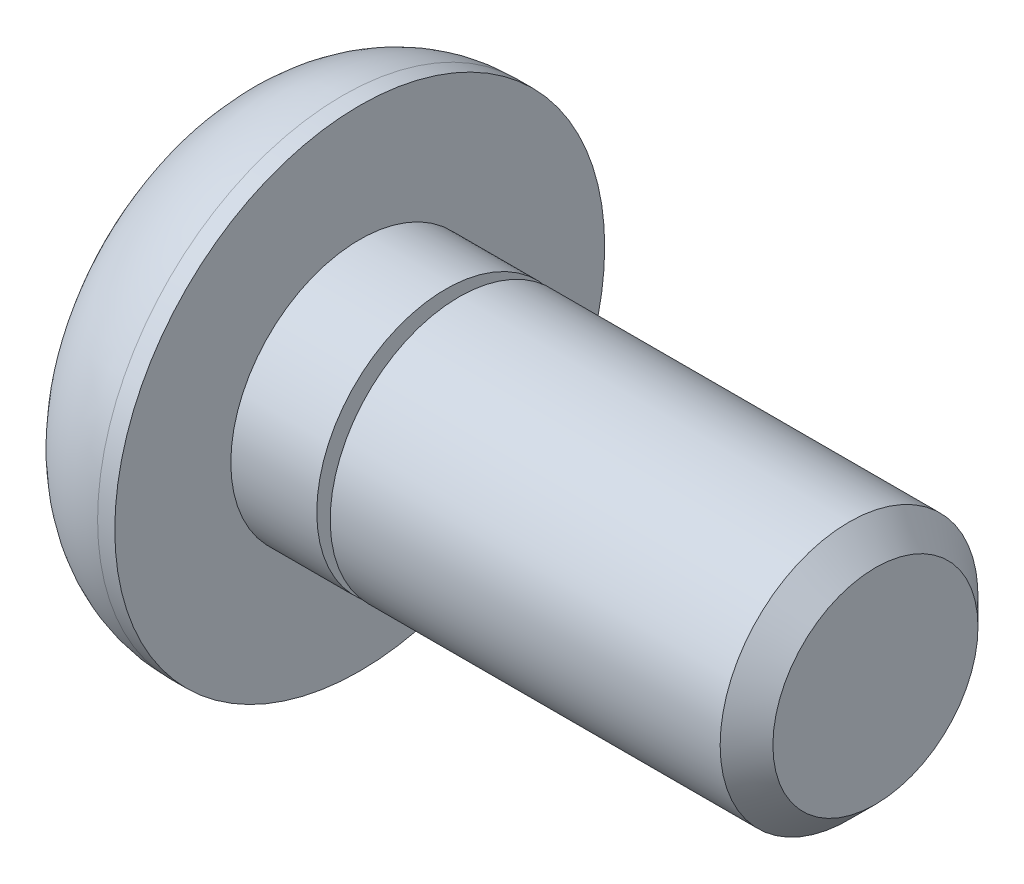
ISO-10303-21;
HEADER;
FILE_DESCRIPTION(('STEP AP214'),'2;1');
FILE_NAME('part.step','',(''),(''),'','','');
FILE_SCHEMA(('AUTOMOTIVE_DESIGN { 1 0 10303 214 1 1 1 1 }'));
ENDSEC;
DATA;
#1=APPLICATION_CONTEXT('core data for automotive mechanical design processes');
#2=APPLICATION_PROTOCOL_DEFINITION('international standard','automotive_design',2000,#1);
#3=PRODUCT_CONTEXT('',#1,'mechanical');
#4=PRODUCT('Part','Part','',(#3));
#5=PRODUCT_RELATED_PRODUCT_CATEGORY('part','',(#4));
#6=PRODUCT_DEFINITION_FORMATION('','',#4);
#7=PRODUCT_DEFINITION_CONTEXT('part definition',#1,'design');
#8=PRODUCT_DEFINITION('design','',#6,#7);
#9=PRODUCT_DEFINITION_SHAPE('','',#8);
#10=(LENGTH_UNIT() NAMED_UNIT(*) SI_UNIT(.MILLI.,.METRE.));
#11=(NAMED_UNIT(*) PLANE_ANGLE_UNIT() SI_UNIT($,.RADIAN.));
#12=(NAMED_UNIT(*) SI_UNIT($,.STERADIAN.) SOLID_ANGLE_UNIT());
#13=UNCERTAINTY_MEASURE_WITH_UNIT(LENGTH_MEASURE(1.E-05),#10,'distance_accuracy_value','');
#14=(GEOMETRIC_REPRESENTATION_CONTEXT(3) GLOBAL_UNCERTAINTY_ASSIGNED_CONTEXT((#13)) GLOBAL_UNIT_ASSIGNED_CONTEXT((#10,
#11,#12)) REPRESENTATION_CONTEXT('',''));
#15=CARTESIAN_POINT('',(0.,0.,0.));
#16=DIRECTION('',(0.,0.,1.));
#17=DIRECTION('',(1.,0.,0.));
#18=AXIS2_PLACEMENT_3D('',#15,#16,#17);
#19=CARTESIAN_POINT('',(6.,0.596637499999982,0.));
#20=DIRECTION('',(1.,0.,0.));
#21=DIRECTION('',(0.,0.,-1.));
#22=AXIS2_PLACEMENT_3D('',#19,#20,#21);
#23=PLANE('',#22);
#24=CARTESIAN_POINT('',(6.00000000014234,0.,0.));
#25=DIRECTION('',(-1.,0.,0.));
#26=DIRECTION('',(0.,0.,1.));
#27=AXIS2_PLACEMENT_3D('',#24,#25,#26);
#28=CIRCLE('',#27,1.19327500010516);
#29=CARTESIAN_POINT('',(6.00000000014234,0.,1.19327500010516));
#30=VERTEX_POINT('',#29);
#31=EDGE_CURVE('E21',#30,#30,#28,.T.);
#32=ORIENTED_EDGE('',*,*,#31,.F.);
#33=EDGE_LOOP('',(#32));
#34=FACE_BOUND('',#33,.T.);
#35=ADVANCED_FACE('F17',(#34),#23,.T.);
#36=CARTESIAN_POINT('',(-0.614001038059087,0.,0.));
#37=DIRECTION('',(-1.,0.,0.));
#38=DIRECTION('',(0.,0.,1.));
#39=AXIS2_PLACEMENT_3D('',#36,#37,#38);
#40=CONICAL_SURFACE('',#39,1.16192999968237,1.04719754998043);
#41=CARTESIAN_POINT('',(-0.610000000702341,1.00000000016001,0.577948959481232));
#42=CARTESIAN_POINT('',(-0.596292373771173,1.00000000005746,0.530505986152384));
#43=CARTESIAN_POINT('',(-0.583741747935691,1.00000000001539,0.482687327252592));
#44=CARTESIAN_POINT('',(-0.561558908292835,0.99999999998455,0.386271956564463));
#45=CARTESIAN_POINT('',(-0.551933247538482,0.999999999995897,0.337673750824826));
#46=CARTESIAN_POINT('',(-0.536453805257682,1.00000000000398,0.241023607057818));
#47=CARTESIAN_POINT('',(-0.530517364442524,1.00000000000106,0.192985324564532));
#48=CARTESIAN_POINT('',(-0.522547942344062,0.999999999998919,0.0966311212873839));
#49=CARTESIAN_POINT('',(-0.52051070889006,0.999999999999701,0.0483155606412382));
#50=CARTESIAN_POINT('',(-0.520510708889989,1.00000000000027,-0.0483155606524448));
#51=CARTESIAN_POINT('',(-0.522547942344025,1.00000000000007,-0.096631121299982));
#52=CARTESIAN_POINT('',(-0.530517364444811,0.999999999999911,-0.192985324579123));
#53=CARTESIAN_POINT('',(-0.536453805262252,0.999999999999966,-0.241023607073011));
#54=CARTESIAN_POINT('',(-0.551933247539297,1.00000000000001,-0.337673750843559));
#55=CARTESIAN_POINT('',(-0.561558908287421,0.999999999999999,-0.386271956586184));
#56=CARTESIAN_POINT('',(-0.583741747950606,0.999999999999976,-0.482687327272268));
#57=CARTESIAN_POINT('',(-0.596292373812606,0.999999999999965,-0.530505986167036));
#58=CARTESIAN_POINT('',(-0.610000000807134,0.999999999999988,-0.577948959481243));
#59=B_SPLINE_CURVE_WITH_KNOTS('',3,(#41,#42,#43,#44,#45,#46,#47,#48,#49,#50,#51,#52,#53,#54,#55,
#56,#57,#58),.UNSPECIFIED.,.F.,.F.,(4,2,2,2,2,2,2,2,4),(0.,0.148196356180967,0.296722322337336,
0.44178762554198,0.5866946415313,0.731601657524353,0.876666960732386,1.02519292689264,
1.17338928307905),.UNSPECIFIED.);
#60=CARTESIAN_POINT('',(-0.610000000832481,0.99999999990011,0.577948959741792));
#61=VERTEX_POINT('',#60);
#62=CARTESIAN_POINT('',(-0.61000000079913,0.999999999900102,-0.577948959626364));
#63=VERTEX_POINT('',#62);
#64=EDGE_CURVE('E89',#61,#63,#59,.T.);
#65=ORIENTED_EDGE('',*,*,#64,.T.);
#66=CARTESIAN_POINT('',(-0.610000000702503,0.999999999904356,-0.577948959924068));
#67=CARTESIAN_POINT('',(-0.59534917236543,0.956037643383835,-0.603317483370583));
#68=CARTESIAN_POINT('',(-0.582026094801958,0.911695794913255,-0.628904993111493));
#69=CARTESIAN_POINT('',(-0.558773550909938,0.8222447053849,-0.680522837345608));
#70=CARTESIAN_POINT('',(-0.548852305246655,0.777133878113073,-0.70655408716543));
#71=CARTESIAN_POINT('',(-0.533412574891243,0.687471128215697,-0.758294070280611));
#72=CARTESIAN_POINT('',(-0.527791260557001,0.642932979674916,-0.783994855226436));
#73=CARTESIAN_POINT('',(-0.521087723057258,0.553647739545833,-0.835516995925321));
#74=CARTESIAN_POINT('',(-0.519999941217122,0.508900971220479,-0.861338165139156));
#75=CARTESIAN_POINT('',(-0.522295914447888,0.425330610921353,-0.909562528489911));
#76=CARTESIAN_POINT('',(-0.525115940353142,0.386494336446535,-0.931973041077401));
#77=CARTESIAN_POINT('',(-0.534043518535486,0.309074734851091,-0.976648102718746));
#78=CARTESIAN_POINT('',(-0.54015410337029,0.270491674343329,-0.99891249792337));
#79=CARTESIAN_POINT('',(-0.555426060565283,0.192913202624641,-1.04367923573479));
#80=CARTESIAN_POINT('',(-0.564651995774482,0.153927580984834,-1.06617592925939));
#81=CARTESIAN_POINT('',(-0.585589692570095,0.0765368941804281,-1.11083430559061));
#82=CARTESIAN_POINT('',(-0.597296553112533,0.0381308420150152,-1.13299655794708));
#83=CARTESIAN_POINT('',(-0.610000000806537,1.77696117710666E-10,-1.15499999989744));
#84=B_SPLINE_CURVE_WITH_KNOTS('',3,(#66,#67,#68,#69,#70,#71,#72,#73,#74,#75,#76,#77,#78,#79,#80,
#81,#82,#83),.UNSPECIFIED.,.F.,.F.,(4,2,2,2,2,2,2,2,4),(0.,0.158549163497736,0.317478810934161,
0.472477440460331,0.627285966377526,0.761939339583402,0.896717021373196,1.03447934505249,
1.17197201608933),.UNSPECIFIED.);
#85=CARTESIAN_POINT('',(-0.610000000799194,0.,-1.15499999988472));
#86=VERTEX_POINT('',#85);
#87=EDGE_CURVE('E117',#63,#86,#84,.T.);
#88=ORIENTED_EDGE('',*,*,#87,.T.);
#89=CARTESIAN_POINT('',(-0.610000000702488,-2.55601366903664E-10,-1.15500000003725));
#90=CARTESIAN_POINT('',(-0.595349172365418,-0.0439623566736196,-1.12963147641311));
#91=CARTESIAN_POINT('',(-0.582026094801948,-0.0883042051021496,-1.10404396659933));
#92=CARTESIAN_POINT('',(-0.55877355090993,-0.177755294599673,-1.05242612231179));
#93=CARTESIAN_POINT('',(-0.548852305246647,-0.222866121882847,-1.02639487251163));
#94=CARTESIAN_POINT('',(-0.533412574891236,-0.312528871788291,-0.974654889410436));
#95=CARTESIAN_POINT('',(-0.527791260556993,-0.357067020326149,-0.948954104459547));
#96=CARTESIAN_POINT('',(-0.521087723057251,-0.446352260453107,-0.897431963756984));
#97=CARTESIAN_POINT('',(-0.519999941217116,-0.491099028779255,-0.871610794544527));
#98=CARTESIAN_POINT('',(-0.522295914447882,-0.574669389078878,-0.823386431194634));
#99=CARTESIAN_POINT('',(-0.525115940353136,-0.613505663553528,-0.80097591860685));
#100=CARTESIAN_POINT('',(-0.53404351853548,-0.690925265148848,-0.756300856965289));
#101=CARTESIAN_POINT('',(-0.540154103370285,-0.729508325656655,-0.734036461760741));
#102=CARTESIAN_POINT('',(-0.555426060565279,-0.80708679737538,-0.689269723949379));
#103=CARTESIAN_POINT('',(-0.564651995774478,-0.846072419015179,-0.666773030424763));
#104=CARTESIAN_POINT('',(-0.585589692570092,-0.923463105819568,-0.622114654093512));
#105=CARTESIAN_POINT('',(-0.597296553112531,-0.961869157984972,-0.59995240173703));
#106=CARTESIAN_POINT('',(-0.610000000806535,-0.99999999982231,-0.577948959786697));
#107=B_SPLINE_CURVE_WITH_KNOTS('',3,(#89,#90,#91,#92,#93,#94,#95,#96,#97,#98,#99,#100,#101,#102,
#103,#104,#105,#106),.UNSPECIFIED.,.F.,.F.,(4,2,2,2,2,2,2,2,4),(0.,0.158549163497733,
0.317478810934154,0.47247744046032,0.627285966377512,0.76193933958339,0.896717021373186,
1.03447934505248,1.17197201608933),.UNSPECIFIED.);
#108=CARTESIAN_POINT('',(-0.610000000799111,-0.99999999990014,-0.577948959626333));
#109=VERTEX_POINT('',#108);
#110=EDGE_CURVE('E147',#86,#109,#107,.T.);
#111=ORIENTED_EDGE('',*,*,#110,.T.);
#112=CARTESIAN_POINT('',(-0.610000000702289,-1.00000000016004,-0.57794895948121));
#113=CARTESIAN_POINT('',(-0.596292373771131,-1.00000000005747,-0.530505986152361));
#114=CARTESIAN_POINT('',(-0.583741747935654,-1.00000000001539,-0.482687327252571));
#115=CARTESIAN_POINT('',(-0.561558908292803,-0.999999999984547,-0.386271956564446));
#116=CARTESIAN_POINT('',(-0.551933247538449,-0.999999999995896,-0.337673750824812));
#117=CARTESIAN_POINT('',(-0.536453805257649,-1.00000000000398,-0.241023607057808));
#118=CARTESIAN_POINT('',(-0.530517364442491,-1.00000000000106,-0.192985324564524));
#119=CARTESIAN_POINT('',(-0.522547942344029,-0.999999999998919,-0.0966311212873802));
#120=CARTESIAN_POINT('',(-0.520510708890027,-0.999999999999701,-0.0483155606412368));
#121=CARTESIAN_POINT('',(-0.520510708889956,-1.00000000000027,0.0483155606524395));
#122=CARTESIAN_POINT('',(-0.522547942343992,-1.00000000000007,0.0966311212999723));
#123=CARTESIAN_POINT('',(-0.530517364444777,-0.999999999999911,0.192985324579104));
#124=CARTESIAN_POINT('',(-0.536453805262217,-0.999999999999966,0.241023607072988));
#125=CARTESIAN_POINT('',(-0.551933247539259,-1.00000000000001,0.337673750843527));
#126=CARTESIAN_POINT('',(-0.561558908287382,-0.999999999999999,0.386271956586148));
#127=CARTESIAN_POINT('',(-0.583741747950565,-0.999999999999976,0.482687327272221));
#128=CARTESIAN_POINT('',(-0.596292373812563,-0.999999999999965,0.530505986166985));
#129=CARTESIAN_POINT('',(-0.61000000080709,-0.999999999999988,0.577948959481188));
#130=B_SPLINE_CURVE_WITH_KNOTS('',3,(#112,#113,#114,#115,#116,#117,#118,#119,#120,#121,#122,
#123,#124,#125,#126,#127,#128,#129),.UNSPECIFIED.,.F.,.F.,(4,2,2,2,2,2,2,2,4),(0.,
0.14819635618096,0.296722322337322,0.441787625541959,0.586694641531272,0.731601657524312,
0.876666960732332,1.02519292689257,1.17338928307897),.UNSPECIFIED.);
#131=CARTESIAN_POINT('',(-0.610000000799104,-0.999999999900135,0.577948959626316));
#132=VERTEX_POINT('',#131);
#133=EDGE_CURVE('E142',#109,#132,#130,.T.);
#134=ORIENTED_EDGE('',*,*,#133,.T.);
#135=CARTESIAN_POINT('',(-0.610000000702512,-0.999999999904404,0.57794895992401));
#136=CARTESIAN_POINT('',(-0.595349172365428,-0.956037643383894,0.603317483370539));
#137=CARTESIAN_POINT('',(-0.582026094801951,-0.911695794913317,0.628904993111454));
#138=CARTESIAN_POINT('',(-0.558773550909926,-0.822244705384964,0.680522837345574));
#139=CARTESIAN_POINT('',(-0.548852305246643,-0.777133878113135,0.706554087165395));
#140=CARTESIAN_POINT('',(-0.53341257489123,-0.687471128215758,0.758294070280576));
#141=CARTESIAN_POINT('',(-0.527791260556986,-0.642932979674976,0.783994855226401));
#142=CARTESIAN_POINT('',(-0.521087723057242,-0.553647739545893,0.835516995925286));
#143=CARTESIAN_POINT('',(-0.519999941217106,-0.508900971220539,0.861338165139122));
#144=CARTESIAN_POINT('',(-0.522295914447871,-0.425330610921409,0.909562528489878));
#145=CARTESIAN_POINT('',(-0.525115940353125,-0.386494336446589,0.93197304107737));
#146=CARTESIAN_POINT('',(-0.534043518535469,-0.309074734851141,0.976648102718717));
#147=CARTESIAN_POINT('',(-0.540154103370274,-0.270491674343376,0.998912497923343));
#148=CARTESIAN_POINT('',(-0.555426060565268,-0.192913202624683,1.04367923573477));
#149=CARTESIAN_POINT('',(-0.564651995774468,-0.153927580984873,1.06617592925937));
#150=CARTESIAN_POINT('',(-0.585589692570083,-0.0765368941804624,1.11083430559059));
#151=CARTESIAN_POINT('',(-0.597296553112522,-0.0381308420150469,1.13299655794706));
#152=CARTESIAN_POINT('',(-0.610000000806527,-1.77725566887248E-10,1.15499999989743));
#153=B_SPLINE_CURVE_WITH_KNOTS('',3,(#135,#136,#137,#138,#139,#140,#141,#142,#143,#144,#145,
#146,#147,#148,#149,#150,#151,#152),.UNSPECIFIED.,.F.,.F.,(4,2,2,2,2,2,2,2,4),(0.,
0.158549163497739,0.317478810934166,0.472477440460337,0.627285966377535,0.761939339583419,
0.896717021373221,1.03447934505253,1.17197201608938),.UNSPECIFIED.);
#154=CARTESIAN_POINT('',(-0.610000000799193,0.,1.15499999988472));
#155=VERTEX_POINT('',#154);
#156=EDGE_CURVE('E92',#132,#155,#153,.T.);
#157=ORIENTED_EDGE('',*,*,#156,.T.);
#158=CARTESIAN_POINT('',(-0.610000000702505,2.55568333301926E-10,1.15500000003726));
#159=CARTESIAN_POINT('',(-0.59534917236543,0.0439623566735909,1.12963147641312));
#160=CARTESIAN_POINT('',(-0.582026094801958,0.0883042051021235,1.10404396659934));
#161=CARTESIAN_POINT('',(-0.55877355090994,0.177755294599651,1.0524261223118));
#162=CARTESIAN_POINT('',(-0.548852305246658,0.222866121882825,1.02639487251164));
#163=CARTESIAN_POINT('',(-0.533412574891248,0.312528871788272,0.974654889410446));
#164=CARTESIAN_POINT('',(-0.527791260557007,0.357067020326131,0.948954104459558));
#165=CARTESIAN_POINT('',(-0.521087723057266,0.446352260453092,0.897431963756993));
#166=CARTESIAN_POINT('',(-0.519999941217132,0.49109902877924,0.871610794544535));
#167=CARTESIAN_POINT('',(-0.5222959144479,0.574669389078861,0.823386431194644));
#168=CARTESIAN_POINT('',(-0.525115940353155,0.613505663553507,0.800975918606863));
#169=CARTESIAN_POINT('',(-0.534043518535499,0.690925265148819,0.756300856965305));
#170=CARTESIAN_POINT('',(-0.540154103370303,0.729508325656622,0.73403646176076));
#171=CARTESIAN_POINT('',(-0.555426060565295,0.80708679737534,0.689269723949402));
#172=CARTESIAN_POINT('',(-0.564651995774494,0.846072419015135,0.666773030424788));
#173=CARTESIAN_POINT('',(-0.585589692570105,0.923463105819516,0.622114654093541));
#174=CARTESIAN_POINT('',(-0.597296553112541,0.961869157984917,0.599952401737062));
#175=CARTESIAN_POINT('',(-0.610000000806544,0.999999999822251,0.57794895978673));
#176=B_SPLINE_CURVE_WITH_KNOTS('',3,(#158,#159,#160,#161,#162,#163,#164,#165,#166,#167,#168,
#169,#170,#171,#172,#173,#174,#175),.UNSPECIFIED.,.F.,.F.,(4,2,2,2,2,2,2,2,4),(0.,
0.158549163497737,0.317478810934162,0.472477440460332,0.627285966377529,0.761939339583393,
0.896717021373176,1.03447934505246,1.17197201608929),.UNSPECIFIED.);
#177=EDGE_CURVE('E62',#155,#61,#176,.T.);
#178=ORIENTED_EDGE('',*,*,#177,.T.);
#179=EDGE_LOOP('',(#65,#88,#111,#134,#157,#178));
#180=FACE_BOUND('',#179,.T.);
#181=CARTESIAN_POINT('',(0.0568395619211515,-1.13686837721616E-10,0.));
#182=VERTEX_POINT('',#181);
#183=VERTEX_LOOP('',#182);
#184=FACE_BOUND('',#183,.T.);
#185=ADVANCED_FACE('F86',(#180,#184),#40,.F.);
#186=CARTESIAN_POINT('',(5.69327499988503,0.,0.));
#187=DIRECTION('',(-1.,0.,0.));
#188=DIRECTION('',(0.,0.,1.));
#189=AXIS2_PLACEMENT_3D('',#186,#187,#188);
#190=CONICAL_SURFACE('',#189,1.49999999979403,0.78539816247083);
#191=CARTESIAN_POINT('',(5.69327500000007,0.,0.));
#192=DIRECTION('',(-1.,0.,0.));
#193=DIRECTION('',(0.,1.,0.));
#194=AXIS2_PLACEMENT_3D('',#191,#192,#193);
#195=CIRCLE('',#194,1.49999999999999);
#196=CARTESIAN_POINT('',(5.69327500000007,1.49999999999997,0.));
#197=VERTEX_POINT('',#196);
#198=EDGE_CURVE('E104',#197,#197,#195,.T.);
#199=ORIENTED_EDGE('',*,*,#198,.F.);
#200=EDGE_LOOP('',(#199));
#201=FACE_BOUND('',#200,.T.);
#202=ORIENTED_EDGE('',*,*,#31,.T.);
#203=EDGE_LOOP('',(#202));
#204=FACE_BOUND('',#203,.T.);
#205=ADVANCED_FACE('F129',(#201,#204),#190,.T.);
#206=CARTESIAN_POINT('',(-1.65000000000003,0.,1.155));
#207=DIRECTION('',(0.,0.499805607369879,0.86613760733594));
#208=DIRECTION('',(0.,-0.86613760733594,0.499805607369879));
#209=AXIS2_PLACEMENT_3D('',#206,#207,#208);
#210=PLANE('',#209);
#211=DIRECTION('',(1.,0.,0.));
#212=VECTOR('',#211,1.);
#213=CARTESIAN_POINT('',(-1.65000000000003,0.,1.15500000000001));
#214=LINE('',#213,#212);
#215=CARTESIAN_POINT('',(-1.65,0.,1.155));
#216=VERTEX_POINT('',#215);
#217=EDGE_CURVE('E94',#155,#216,#214,.F.);
#218=ORIENTED_EDGE('',*,*,#217,.T.);
#219=DIRECTION('',(0.,-0.866137607335932,0.499805607369892));
#220=VECTOR('',#219,1.);
#221=CARTESIAN_POINT('',(-1.64999999999998,0.999999999999988,0.577948959684148));
#222=LINE('',#221,#220);
#223=CARTESIAN_POINT('',(-1.65000000000003,0.999999999999988,0.577948959684148));
#224=VERTEX_POINT('',#223);
#225=EDGE_CURVE('E83',#224,#216,#222,.T.);
#226=ORIENTED_EDGE('',*,*,#225,.F.);
#227=DIRECTION('',(1.,0.,0.));
#228=VECTOR('',#227,1.);
#229=CARTESIAN_POINT('',(-1.65000000000003,0.999999999999988,0.577948959684148));
#230=LINE('',#229,#228);
#231=EDGE_CURVE('E95',#224,#61,#230,.T.);
#232=ORIENTED_EDGE('',*,*,#231,.T.);
#233=ORIENTED_EDGE('',*,*,#177,.F.);
#234=EDGE_LOOP('',(#218,#226,#232,#233));
#235=FACE_BOUND('',#234,.T.);
#236=ADVANCED_FACE('F96',(#235),#210,.F.);
#237=CARTESIAN_POINT('',(-1.65000000000003,-0.999999999999988,0.577948959684148));
#238=DIRECTION('',(0.,-0.499805607369879,0.86613760733594));
#239=DIRECTION('',(0.,-0.86613760733594,-0.499805607369879));
#240=AXIS2_PLACEMENT_3D('',#237,#238,#239);
#241=PLANE('',#240);
#242=DIRECTION('',(1.,0.,0.));
#243=VECTOR('',#242,1.);
#244=CARTESIAN_POINT('',(-1.65000000000003,-0.999999999999988,0.577948959684097));
#245=LINE('',#244,#243);
#246=CARTESIAN_POINT('',(-1.65,-0.999999999999988,0.577948959684116));
#247=VERTEX_POINT('',#246);
#248=EDGE_CURVE('E265',#132,#247,#245,.F.);
#249=ORIENTED_EDGE('',*,*,#248,.T.);
#250=DIRECTION('',(0.,-0.866137607335932,-0.499805607369892));
#251=VECTOR('',#250,1.);
#252=CARTESIAN_POINT('',(-1.64999999999998,0.,1.155));
#253=LINE('',#252,#251);
#254=EDGE_CURVE('E228',#216,#247,#253,.T.);
#255=ORIENTED_EDGE('',*,*,#254,.F.);
#256=ORIENTED_EDGE('',*,*,#217,.F.);
#257=ORIENTED_EDGE('',*,*,#156,.F.);
#258=EDGE_LOOP('',(#249,#255,#256,#257));
#259=FACE_BOUND('',#258,.T.);
#260=ADVANCED_FACE('F263',(#259),#241,.F.);
#261=CARTESIAN_POINT('',(-1.65000000000003,-0.999999999999988,-0.577948959684148));
#262=DIRECTION('',(0.,-1.,0.));
#263=DIRECTION('',(0.,0.,-1.));
#264=AXIS2_PLACEMENT_3D('',#261,#262,#263);
#265=PLANE('',#264);
#266=DIRECTION('',(1.,0.,0.));
#267=VECTOR('',#266,1.);
#268=CARTESIAN_POINT('',(-1.65000000000003,-1.00000000000008,-0.577948959684112));
#269=LINE('',#268,#267);
#270=CARTESIAN_POINT('',(-1.65,-1.00000000000005,-0.577948959684124));
#271=VERTEX_POINT('',#270);
#272=EDGE_CURVE('E154',#109,#271,#269,.F.);
#273=ORIENTED_EDGE('',*,*,#272,.T.);
#274=DIRECTION('',(0.,0.,1.));
#275=VECTOR('',#274,1.);
#276=CARTESIAN_POINT('',(-1.64999999999998,-0.999999999999988,0.));
#277=LINE('',#276,#275);
#278=EDGE_CURVE('E242',#247,#271,#277,.F.);
#279=ORIENTED_EDGE('',*,*,#278,.F.);
#280=ORIENTED_EDGE('',*,*,#248,.F.);
#281=ORIENTED_EDGE('',*,*,#133,.F.);
#282=EDGE_LOOP('',(#273,#279,#280,#281));
#283=FACE_BOUND('',#282,.T.);
#284=ADVANCED_FACE('F159',(#283),#265,.F.);
#285=CARTESIAN_POINT('',(-1.65000000000003,0.,-1.155));
#286=DIRECTION('',(0.,-0.499805607369879,-0.86613760733594));
#287=DIRECTION('',(0.,0.86613760733594,-0.499805607369879));
#288=AXIS2_PLACEMENT_3D('',#285,#286,#287);
#289=PLANE('',#288);
#290=DIRECTION('',(1.,0.,0.));
#291=VECTOR('',#290,1.);
#292=CARTESIAN_POINT('',(-1.65000000000003,0.,-1.15500000000002));
#293=LINE('',#292,#291);
#294=CARTESIAN_POINT('',(-1.65,0.,-1.15500000000001));
#295=VERTEX_POINT('',#294);
#296=EDGE_CURVE('E153',#86,#295,#293,.F.);
#297=ORIENTED_EDGE('',*,*,#296,.T.);
#298=DIRECTION('',(0.,0.866137607335932,-0.499805607369892));
#299=VECTOR('',#298,1.);
#300=CARTESIAN_POINT('',(-1.64999999999998,-0.999999999999988,-0.577948959684148));
#301=LINE('',#300,#299);
#302=EDGE_CURVE('E237',#271,#295,#301,.T.);
#303=ORIENTED_EDGE('',*,*,#302,.F.);
#304=ORIENTED_EDGE('',*,*,#272,.F.);
#305=ORIENTED_EDGE('',*,*,#110,.F.);
#306=EDGE_LOOP('',(#297,#303,#304,#305));
#307=FACE_BOUND('',#306,.T.);
#308=ADVANCED_FACE('F155',(#307),#289,.F.);
#309=CARTESIAN_POINT('',(-1.65000000000003,0.999999999999988,-0.577948959684148));
#310=DIRECTION('',(0.,0.499805607369879,-0.86613760733594));
#311=DIRECTION('',(0.,0.86613760733594,0.499805607369879));
#312=AXIS2_PLACEMENT_3D('',#309,#310,#311);
#313=PLANE('',#312);
#314=DIRECTION('',(1.,0.,0.));
#315=VECTOR('',#314,1.);
#316=CARTESIAN_POINT('',(-1.65000000000003,0.999999999999988,-0.577948959684173));
#317=LINE('',#316,#315);
#318=CARTESIAN_POINT('',(-1.65,0.999999999999988,-0.577948959684164));
#319=VERTEX_POINT('',#318);
#320=EDGE_CURVE('E100',#63,#319,#317,.F.);
#321=ORIENTED_EDGE('',*,*,#320,.T.);
#322=DIRECTION('',(0.,0.866137607335932,0.499805607369892));
#323=VECTOR('',#322,1.);
#324=CARTESIAN_POINT('',(-1.64999999999998,0.,-1.155));
#325=LINE('',#324,#323);
#326=EDGE_CURVE('E232',#295,#319,#325,.T.);
#327=ORIENTED_EDGE('',*,*,#326,.F.);
#328=ORIENTED_EDGE('',*,*,#296,.F.);
#329=ORIENTED_EDGE('',*,*,#87,.F.);
#330=EDGE_LOOP('',(#321,#327,#328,#329));
#331=FACE_BOUND('',#330,.T.);
#332=ADVANCED_FACE('F158',(#331),#313,.F.);
#333=CARTESIAN_POINT('',(-1.65000000000003,0.999999999999988,0.577948959684148));
#334=DIRECTION('',(0.,1.,0.));
#335=DIRECTION('',(0.,0.,1.));
#336=AXIS2_PLACEMENT_3D('',#333,#334,#335);
#337=PLANE('',#336);
#338=ORIENTED_EDGE('',*,*,#231,.F.);
#339=DIRECTION('',(0.,0.,1.));
#340=VECTOR('',#339,1.);
#341=CARTESIAN_POINT('',(-1.64999999999998,0.999999999999988,0.));
#342=LINE('',#341,#340);
#343=EDGE_CURVE('E225',#319,#224,#342,.T.);
#344=ORIENTED_EDGE('',*,*,#343,.F.);
#345=ORIENTED_EDGE('',*,*,#320,.F.);
#346=ORIENTED_EDGE('',*,*,#64,.F.);
#347=EDGE_LOOP('',(#338,#344,#345,#346));
#348=FACE_BOUND('',#347,.T.);
#349=ADVANCED_FACE('F103',(#348),#337,.F.);
#350=CARTESIAN_POINT('',(5.69327500000007,0.,0.));
#351=DIRECTION('',(-1.,0.,0.));
#352=DIRECTION('',(0.,0.,1.));
#353=AXIS2_PLACEMENT_3D('',#350,#351,#352);
#354=CYLINDRICAL_SURFACE('',#353,1.49999999999999);
#355=CARTESIAN_POINT('',(1.15630773524344,0.,0.));
#356=DIRECTION('',(1.,0.,0.));
#357=DIRECTION('',(0.,1.,0.));
#358=AXIS2_PLACEMENT_3D('',#355,#356,#357);
#359=CIRCLE('',#358,1.49999999990769);
#360=CARTESIAN_POINT('',(1.15630773524344,1.49999999990769,0.));
#361=VERTEX_POINT('',#360);
#362=EDGE_CURVE('E214',#361,#361,#359,.F.);
#363=ORIENTED_EDGE('',*,*,#362,.F.);
#364=EDGE_LOOP('',(#363));
#365=FACE_BOUND('',#364,.T.);
#366=ORIENTED_EDGE('',*,*,#198,.T.);
#367=EDGE_LOOP('',(#366));
#368=FACE_BOUND('',#367,.T.);
#369=ADVANCED_FACE('F169',(#365,#368),#354,.T.);
#370=CARTESIAN_POINT('',(-1.64999999999998,2.00249999999999,0.));
#371=DIRECTION('',(-1.,0.,0.));
#372=DIRECTION('',(0.,0.,1.));
#373=AXIS2_PLACEMENT_3D('',#370,#371,#372);
#374=PLANE('',#373);
#375=ORIENTED_EDGE('',*,*,#326,.T.);
#376=ORIENTED_EDGE('',*,*,#343,.T.);
#377=ORIENTED_EDGE('',*,*,#225,.T.);
#378=ORIENTED_EDGE('',*,*,#254,.T.);
#379=ORIENTED_EDGE('',*,*,#278,.T.);
#380=ORIENTED_EDGE('',*,*,#302,.T.);
#381=EDGE_LOOP('',(#375,#376,#377,#378,#379,#380));
#382=FACE_BOUND('',#381,.T.);
#383=CARTESIAN_POINT('',(-1.64999999999998,0.,-1.40000000000001));
#384=CARTESIAN_POINT('',(-1.64999999999998,-0.267029032391374,-1.39989883160472));
#385=CARTESIAN_POINT('',(-1.64999999999998,-0.515332593386627,-1.30170362148742));
#386=CARTESIAN_POINT('',(-1.64999999999998,-0.784472673853695,-1.19526831042493));
#387=CARTESIAN_POINT('',(-1.64999999999998,-0.989949493661176,-0.989949493661176));
#388=CARTESIAN_POINT('',(-1.64999999999998,-1.19468083660478,-0.78537558052091));
#389=CARTESIAN_POINT('',(-1.64999999999998,-1.30170362148741,-0.515332593386628));
#390=CARTESIAN_POINT('',(-1.64999999999998,-1.39989862888173,-0.26756410981079));
#391=CARTESIAN_POINT('',(-1.64999999999998,-1.40000000000001,0.));
#392=CARTESIAN_POINT('',(-1.64999999999998,-1.40010097473616,0.266517878545195));
#393=CARTESIAN_POINT('',(-1.64999999999998,-1.30170362148741,0.515332593386627));
#394=CARTESIAN_POINT('',(-1.64999999999998,-1.19526831042469,0.784472673853878));
#395=CARTESIAN_POINT('',(-1.64999999999998,-0.989949493661177,0.989949493661176));
#396=CARTESIAN_POINT('',(-1.64999999999998,-0.785375580521085,1.19468083660466));
#397=CARTESIAN_POINT('',(-1.64999999999998,-0.515332593386628,1.30170362148741));
#398=CARTESIAN_POINT('',(-1.64999999999998,-0.267564109810766,1.39989862888179));
#399=CARTESIAN_POINT('',(-1.64999999999998,0.,1.40000000000001));
#400=B_SPLINE_CURVE_WITH_KNOTS('',2,(#383,#384,#385,#386,#387,#388,#389,#390,#391,#392,#393,
#394,#395,#396,#397,#398,#399),.UNSPECIFIED.,.F.,.F.,(3,2,2,2,2,2,2,2,3),(0.,0.125,0.25,0.375,
0.5,0.625,0.75,0.875,1.),.UNSPECIFIED.);
#401=CARTESIAN_POINT('',(-1.64999999999998,0.,-1.4));
#402=VERTEX_POINT('',#401);
#403=CARTESIAN_POINT('',(-1.64999999999998,0.,1.40000000000001));
#404=VERTEX_POINT('',#403);
#405=EDGE_CURVE('E36',#402,#404,#400,.T.);
#406=ORIENTED_EDGE('',*,*,#405,.T.);
#407=CARTESIAN_POINT('',(-1.64999999999998,0.,1.40000000000001));
#408=CARTESIAN_POINT('',(-1.64999999999998,0.267029032391413,1.39989883160478));
#409=CARTESIAN_POINT('',(-1.64999999999998,0.515332593386627,1.30170362148742));
#410=CARTESIAN_POINT('',(-1.64999999999998,0.784472673853724,1.19526831042484));
#411=CARTESIAN_POINT('',(-1.64999999999998,0.989949493661176,0.989949493661176));
#412=CARTESIAN_POINT('',(-1.64999999999998,1.19468083660464,0.7853755805211));
#413=CARTESIAN_POINT('',(-1.64999999999998,1.30170362148742,0.515332593386627));
#414=CARTESIAN_POINT('',(-1.64999999999998,1.39989862888184,0.267564109810648));
#415=CARTESIAN_POINT('',(-1.64999999999998,1.40000000000001,0.));
#416=B_SPLINE_CURVE_WITH_KNOTS('',2,(#407,#408,#409,#410,#411,#412,#413,#414,#415),
.UNSPECIFIED.,.F.,.F.,(3,2,2,2,3),(0.,0.25,0.5,0.75,1.),.UNSPECIFIED.);
#417=CARTESIAN_POINT('',(-1.64999999999998,1.40000000000001,0.));
#418=VERTEX_POINT('',#417);
#419=EDGE_CURVE('E206',#404,#418,#416,.T.);
#420=ORIENTED_EDGE('',*,*,#419,.T.);
#421=CARTESIAN_POINT('',(-1.64999999999998,1.40000000000001,0.));
#422=CARTESIAN_POINT('',(-1.64999999999998,1.39989883160483,-0.267029032391164));
#423=CARTESIAN_POINT('',(-1.64999999999998,1.30170362148742,-0.515332593386627));
#424=CARTESIAN_POINT('',(-1.64999999999998,1.19526831042496,-0.784472673853549));
#425=CARTESIAN_POINT('',(-1.64999999999998,0.989949493661176,-0.989949493661176));
#426=CARTESIAN_POINT('',(-1.64999999999998,0.785375580521211,-1.19468083660459));
#427=CARTESIAN_POINT('',(-1.64999999999998,0.515332593386627,-1.30170362148742));
#428=CARTESIAN_POINT('',(-1.64999999999998,0.267564109810944,-1.39989862888173));
#429=CARTESIAN_POINT('',(-1.64999999999998,0.,-1.40000000000001));
#430=B_SPLINE_CURVE_WITH_KNOTS('',2,(#421,#422,#423,#424,#425,#426,#427,#428,#429),
.UNSPECIFIED.,.F.,.F.,(3,2,2,2,3),(0.,0.25,0.5,0.75,1.),.UNSPECIFIED.);
#431=EDGE_CURVE('E200',#418,#402,#430,.T.);
#432=ORIENTED_EDGE('',*,*,#431,.T.);
#433=EDGE_LOOP('',(#406,#420,#432));
#434=FACE_BOUND('',#433,.T.);
#435=ADVANCED_FACE('F192',(#382,#434),#374,.T.);
#436=CARTESIAN_POINT('',(1.15630773524344,0.,0.));
#437=DIRECTION('',(1.,0.,0.));
#438=DIRECTION('',(0.,0.,-1.));
#439=AXIS2_PLACEMENT_3D('',#436,#437,#438);
#440=CONICAL_SURFACE('',#439,1.49999999990769,1.0471975499748);
#441=CARTESIAN_POINT('',(0.999999999862666,0.,0.));
#442=DIRECTION('',(1.,0.,0.));
#443=DIRECTION('',(0.,0.,-1.));
#444=AXIS2_PLACEMENT_3D('',#441,#442,#443);
#445=CIRCLE('',#444,1.22926706137605);
#446=CARTESIAN_POINT('',(0.999999999862666,0.,-1.22926706137605));
#447=VERTEX_POINT('',#446);
#448=EDGE_CURVE('E115',#447,#447,#445,.T.);
#449=ORIENTED_EDGE('',*,*,#448,.T.);
#450=EDGE_LOOP('',(#449));
#451=FACE_BOUND('',#450,.T.);
#452=ORIENTED_EDGE('',*,*,#362,.T.);
#453=EDGE_LOOP('',(#452));
#454=FACE_BOUND('',#453,.T.);
#455=ADVANCED_FACE('F189',(#451,#454),#440,.T.);
#456=CARTESIAN_POINT('',(-0.199999999999936,0.,0.));
#457=DIRECTION('',(-1.,0.,0.));
#458=DIRECTION('',(0.,0.,1.));
#459=AXIS2_PLACEMENT_3D('',#456,#457,#458);
#460=DEGENERATE_TOROIDAL_SURFACE('',#459,1.4,1.45000000000001,.T.);
#461=CARTESIAN_POINT('',(-0.199999999999937,0.,0.));
#462=DIRECTION('',(-1.,0.,0.));
#463=DIRECTION('',(0.,1.,0.));
#464=AXIS2_PLACEMENT_3D('',#461,#462,#463);
#465=CIRCLE('',#464,2.85000000000003);
#466=CARTESIAN_POINT('',(-0.199999999999937,2.85,0.));
#467=VERTEX_POINT('',#466);
#468=EDGE_CURVE('E215',#467,#467,#465,.F.);
#469=ORIENTED_EDGE('',*,*,#468,.F.);
#470=EDGE_LOOP('',(#469));
#471=FACE_BOUND('',#470,.T.);
#472=ORIENTED_EDGE('',*,*,#419,.F.);
#473=ORIENTED_EDGE('',*,*,#405,.F.);
#474=ORIENTED_EDGE('',*,*,#431,.F.);
#475=EDGE_LOOP('',(#472,#473,#474));
#476=FACE_BOUND('',#475,.T.);
#477=ADVANCED_FACE('F19',(#471,#476),#460,.T.);
#478=CARTESIAN_POINT('',(1.00000000000006,1.3646335306587,0.));
#479=DIRECTION('',(-1.,0.,0.));
#480=DIRECTION('',(0.,0.,1.));
#481=AXIS2_PLACEMENT_3D('',#478,#479,#480);
#482=PLANE('',#481);
#483=ORIENTED_EDGE('',*,*,#448,.F.);
#484=EDGE_LOOP('',(#483));
#485=FACE_BOUND('',#484,.T.);
#486=CARTESIAN_POINT('',(1.00000000000006,0.,0.));
#487=DIRECTION('',(-1.,0.,0.));
#488=DIRECTION('',(0.,0.,1.));
#489=AXIS2_PLACEMENT_3D('',#486,#487,#488);
#490=CIRCLE('',#489,1.49999999999999);
#491=CARTESIAN_POINT('',(1.00000000000006,0.,1.49999999999999));
#492=VERTEX_POINT('',#491);
#493=EDGE_CURVE('E223',#492,#492,#490,.T.);
#494=ORIENTED_EDGE('',*,*,#493,.F.);
#495=EDGE_LOOP('',(#494));
#496=FACE_BOUND('',#495,.T.);
#497=ADVANCED_FACE('F184',(#485,#496),#482,.F.);
#498=CARTESIAN_POINT('',(0.,0.,0.));
#499=DIRECTION('',(-1.,0.,0.));
#500=DIRECTION('',(0.,0.,1.));
#501=AXIS2_PLACEMENT_3D('',#498,#499,#500);
#502=CYLINDRICAL_SURFACE('',#501,2.85000000000003);
#503=ORIENTED_EDGE('',*,*,#468,.T.);
#504=EDGE_LOOP('',(#503));
#505=FACE_BOUND('',#504,.T.);
#506=CARTESIAN_POINT('',(0.,0.,0.));
#507=DIRECTION('',(-1.,0.,0.));
#508=DIRECTION('',(0.,0.,1.));
#509=AXIS2_PLACEMENT_3D('',#506,#507,#508);
#510=CIRCLE('',#509,2.85000000000003);
#511=CARTESIAN_POINT('',(0.,0.,2.85000000000003));
#512=VERTEX_POINT('',#511);
#513=EDGE_CURVE('E27',#512,#512,#510,.F.);
#514=ORIENTED_EDGE('',*,*,#513,.F.);
#515=EDGE_LOOP('',(#514));
#516=FACE_BOUND('',#515,.T.);
#517=ADVANCED_FACE('F177',(#505,#516),#502,.T.);
#518=CARTESIAN_POINT('',(1.00000000000006,0.,0.));
#519=DIRECTION('',(-1.,0.,0.));
#520=DIRECTION('',(0.,0.,1.));
#521=AXIS2_PLACEMENT_3D('',#518,#519,#520);
#522=CYLINDRICAL_SURFACE('',#521,1.49999999999999);
#523=CARTESIAN_POINT('',(0.,0.,0.));
#524=DIRECTION('',(-1.,0.,0.));
#525=DIRECTION('',(0.,0.,1.));
#526=AXIS2_PLACEMENT_3D('',#523,#524,#525);
#527=CIRCLE('',#526,1.49999999999999);
#528=CARTESIAN_POINT('',(0.,0.,1.49999999999999));
#529=VERTEX_POINT('',#528);
#530=EDGE_CURVE('E11',#529,#529,#527,.T.);
#531=ORIENTED_EDGE('',*,*,#530,.F.);
#532=EDGE_LOOP('',(#531));
#533=FACE_BOUND('',#532,.T.);
#534=ORIENTED_EDGE('',*,*,#493,.T.);
#535=EDGE_LOOP('',(#534));
#536=FACE_BOUND('',#535,.T.);
#537=ADVANCED_FACE('F172',(#533,#536),#522,.T.);
#538=CARTESIAN_POINT('',(0.,2.17499999999999,0.));
#539=DIRECTION('',(1.,0.,0.));
#540=DIRECTION('',(0.,0.,-1.));
#541=AXIS2_PLACEMENT_3D('',#538,#539,#540);
#542=PLANE('',#541);
#543=ORIENTED_EDGE('',*,*,#530,.T.);
#544=EDGE_LOOP('',(#543));
#545=FACE_BOUND('',#544,.T.);
#546=ORIENTED_EDGE('',*,*,#513,.T.);
#547=EDGE_LOOP('',(#546));
#548=FACE_BOUND('',#547,.T.);
#549=ADVANCED_FACE('F170',(#545,#548),#542,.T.);
#550=CLOSED_SHELL('',(#35,#185,#205,#236,#260,#284,#308,#332,#349,#369,#435,#455,#477,#497,#517,
#537,#549));
#551=MANIFOLD_SOLID_BREP('B1',#550);
#552=ADVANCED_BREP_SHAPE_REPRESENTATION('',(#18,#551),#14);
#553=SHAPE_DEFINITION_REPRESENTATION(#9,#552);
ENDSEC;
END-ISO-10303-21;
